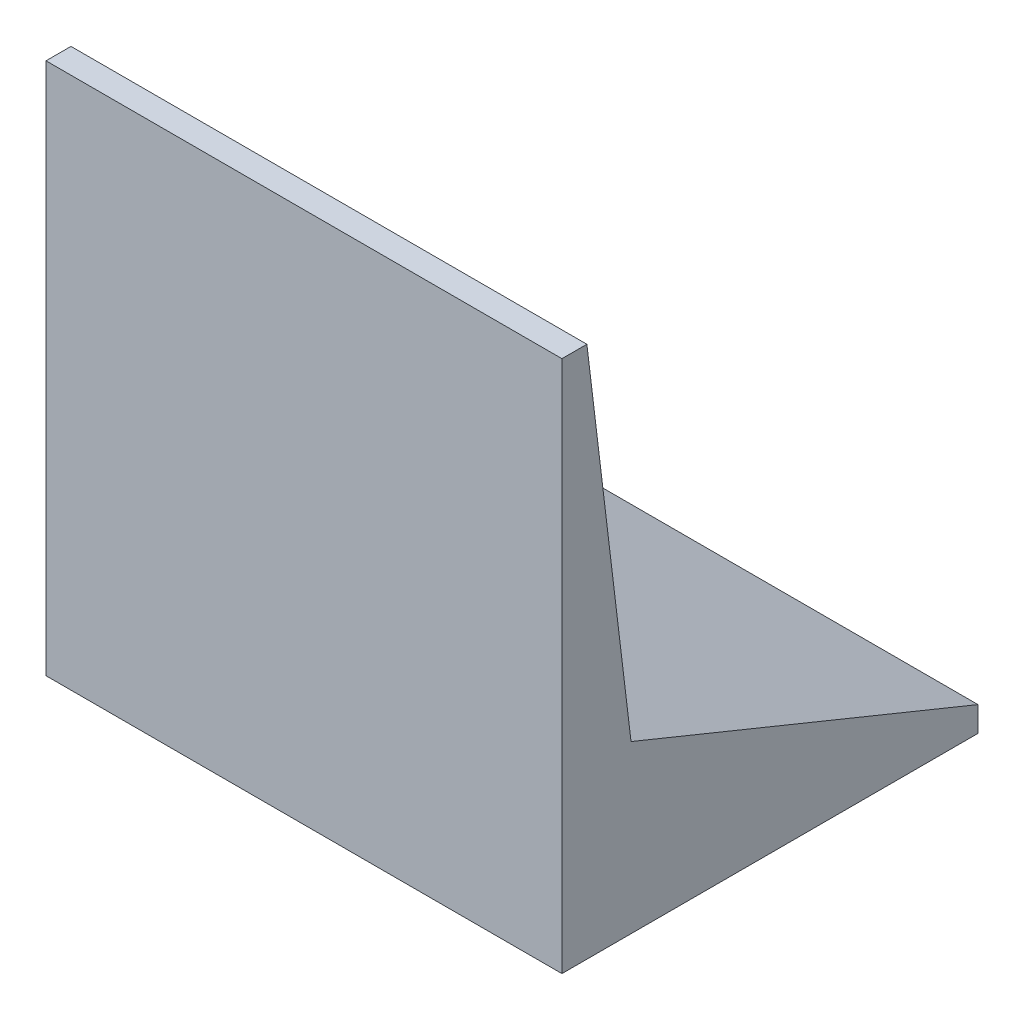
ISO-10303-21;
HEADER;
FILE_DESCRIPTION(('STEP AP214'),'2;1');
FILE_NAME('part.step','',(''),(''),'','','');
FILE_SCHEMA(('AUTOMOTIVE_DESIGN { 1 0 10303 214 1 1 1 1 }'));
ENDSEC;
DATA;
#1=APPLICATION_CONTEXT('core data for automotive mechanical design processes');
#2=APPLICATION_PROTOCOL_DEFINITION('international standard','automotive_design',2000,#1);
#3=PRODUCT_CONTEXT('',#1,'mechanical');
#4=PRODUCT('Part','Part','',(#3));
#5=PRODUCT_RELATED_PRODUCT_CATEGORY('part','',(#4));
#6=PRODUCT_DEFINITION_FORMATION('','',#4);
#7=PRODUCT_DEFINITION_CONTEXT('part definition',#1,'design');
#8=PRODUCT_DEFINITION('design','',#6,#7);
#9=PRODUCT_DEFINITION_SHAPE('','',#8);
#10=(LENGTH_UNIT() NAMED_UNIT(*) SI_UNIT(.MILLI.,.METRE.));
#11=(NAMED_UNIT(*) PLANE_ANGLE_UNIT() SI_UNIT($,.RADIAN.));
#12=(NAMED_UNIT(*) SI_UNIT($,.STERADIAN.) SOLID_ANGLE_UNIT());
#13=UNCERTAINTY_MEASURE_WITH_UNIT(LENGTH_MEASURE(1.E-05),#10,'distance_accuracy_value','');
#14=(GEOMETRIC_REPRESENTATION_CONTEXT(3) GLOBAL_UNCERTAINTY_ASSIGNED_CONTEXT((#13)) GLOBAL_UNIT_ASSIGNED_CONTEXT((#10,
#11,#12)) REPRESENTATION_CONTEXT('',''));
#15=CARTESIAN_POINT('',(0.,0.,0.));
#16=DIRECTION('',(0.,0.,1.));
#17=DIRECTION('',(1.,0.,0.));
#18=AXIS2_PLACEMENT_3D('',#15,#16,#17);
#19=CARTESIAN_POINT('',(310.,15.,0.));
#20=DIRECTION('',(0.,0.,1.));
#21=DIRECTION('',(1.,0.,0.));
#22=AXIS2_PLACEMENT_3D('',#19,#20,#21);
#23=PLANE('',#22);
#24=DIRECTION('',(0.,1.,0.));
#25=VECTOR('',#24,1.);
#26=CARTESIAN_POINT('',(0.,15.,0.));
#27=LINE('',#26,#25);
#28=CARTESIAN_POINT('',(0.,0.,0.));
#29=VERTEX_POINT('',#28);
#30=CARTESIAN_POINT('',(0.,15.,0.));
#31=VERTEX_POINT('',#30);
#32=EDGE_CURVE('E117',#29,#31,#27,.T.);
#33=ORIENTED_EDGE('',*,*,#32,.T.);
#34=DIRECTION('',(-1.,0.,0.));
#35=VECTOR('',#34,1.);
#36=CARTESIAN_POINT('',(310.,15.,0.));
#37=LINE('',#36,#35);
#38=CARTESIAN_POINT('',(310.,15.,0.));
#39=VERTEX_POINT('',#38);
#40=EDGE_CURVE('E11',#39,#31,#37,.T.);
#41=ORIENTED_EDGE('',*,*,#40,.F.);
#42=DIRECTION('',(0.,1.,0.));
#43=VECTOR('',#42,1.);
#44=CARTESIAN_POINT('',(310.,15.,0.));
#45=LINE('',#44,#43);
#46=CARTESIAN_POINT('',(310.,0.,0.));
#47=VERTEX_POINT('',#46);
#48=EDGE_CURVE('E127',#47,#39,#45,.T.);
#49=ORIENTED_EDGE('',*,*,#48,.F.);
#50=DIRECTION('',(-1.,0.,0.));
#51=VECTOR('',#50,1.);
#52=CARTESIAN_POINT('',(310.,0.,0.));
#53=LINE('',#52,#51);
#54=EDGE_CURVE('E113',#47,#29,#53,.T.);
#55=ORIENTED_EDGE('',*,*,#54,.T.);
#56=EDGE_LOOP('',(#33,#41,#49,#55));
#57=FACE_BOUND('',#56,.T.);
#58=ADVANCED_FACE('F33',(#57),#23,.F.);
#59=CARTESIAN_POINT('',(310.,99.9999999999999,208.478747203579));
#60=DIRECTION('',(0.,-0.925992669111965,0.377541490105259));
#61=DIRECTION('',(0.,-0.377541490105259,-0.925992669111965));
#62=AXIS2_PLACEMENT_3D('',#59,#60,#61);
#63=PLANE('',#62);
#64=DIRECTION('',(0.,0.377541490105259,0.925992669111965));
#65=VECTOR('',#64,1.);
#66=CARTESIAN_POINT('',(0.,99.9999999999999,208.478747203579));
#67=LINE('',#66,#65);
#68=CARTESIAN_POINT('',(0.,99.9999999999999,208.478747203579));
#69=VERTEX_POINT('',#68);
#70=EDGE_CURVE('E120',#31,#69,#67,.T.);
#71=ORIENTED_EDGE('',*,*,#70,.T.);
#72=DIRECTION('',(-1.,0.,0.));
#73=VECTOR('',#72,1.);
#74=CARTESIAN_POINT('',(310.,99.9999999999999,208.478747203579));
#75=LINE('',#74,#73);
#76=CARTESIAN_POINT('',(310.,99.9999999999999,208.478747203579));
#77=VERTEX_POINT('',#76);
#78=EDGE_CURVE('E41',#77,#69,#75,.T.);
#79=ORIENTED_EDGE('',*,*,#78,.F.);
#80=DIRECTION('',(0.,0.377541490105259,0.925992669111965));
#81=VECTOR('',#80,1.);
#82=CARTESIAN_POINT('',(310.,99.9999999999999,208.478747203579));
#83=LINE('',#82,#81);
#84=EDGE_CURVE('E86',#39,#77,#83,.T.);
#85=ORIENTED_EDGE('',*,*,#84,.F.);
#86=ORIENTED_EDGE('',*,*,#40,.T.);
#87=EDGE_LOOP('',(#71,#79,#85,#86));
#88=FACE_BOUND('',#87,.T.);
#89=ADVANCED_FACE('F151',(#88),#63,.F.);
#90=CARTESIAN_POINT('',(310.,320.,235.));
#91=DIRECTION('',(0.,-0.119684622784284,0.992811961586374));
#92=DIRECTION('',(0.,-0.992811961586374,-0.119684622784284));
#93=AXIS2_PLACEMENT_3D('',#90,#91,#92);
#94=PLANE('',#93);
#95=DIRECTION('',(0.,0.992811961586374,0.119684622784284));
#96=VECTOR('',#95,1.);
#97=CARTESIAN_POINT('',(0.,320.,235.));
#98=LINE('',#97,#96);
#99=CARTESIAN_POINT('',(0.,320.,235.));
#100=VERTEX_POINT('',#99);
#101=EDGE_CURVE('E122',#69,#100,#98,.T.);
#102=ORIENTED_EDGE('',*,*,#101,.T.);
#103=DIRECTION('',(-1.,0.,0.));
#104=VECTOR('',#103,1.);
#105=CARTESIAN_POINT('',(310.,320.,235.));
#106=LINE('',#105,#104);
#107=CARTESIAN_POINT('',(310.,320.,235.));
#108=VERTEX_POINT('',#107);
#109=EDGE_CURVE('E108',#108,#100,#106,.T.);
#110=ORIENTED_EDGE('',*,*,#109,.F.);
#111=DIRECTION('',(0.,0.992811961586374,0.119684622784284));
#112=VECTOR('',#111,1.);
#113=CARTESIAN_POINT('',(310.,320.,235.));
#114=LINE('',#113,#112);
#115=EDGE_CURVE('E99',#77,#108,#114,.T.);
#116=ORIENTED_EDGE('',*,*,#115,.F.);
#117=ORIENTED_EDGE('',*,*,#78,.T.);
#118=EDGE_LOOP('',(#102,#110,#116,#117));
#119=FACE_BOUND('',#118,.T.);
#120=ADVANCED_FACE('F133',(#119),#94,.F.);
#121=CARTESIAN_POINT('',(310.,320.,250.));
#122=DIRECTION('',(0.,-1.,0.));
#123=DIRECTION('',(0.,0.,-1.));
#124=AXIS2_PLACEMENT_3D('',#121,#122,#123);
#125=PLANE('',#124);
#126=DIRECTION('',(0.,0.,1.));
#127=VECTOR('',#126,1.);
#128=CARTESIAN_POINT('',(0.,320.,250.));
#129=LINE('',#128,#127);
#130=CARTESIAN_POINT('',(0.,320.,250.));
#131=VERTEX_POINT('',#130);
#132=EDGE_CURVE('E107',#100,#131,#129,.T.);
#133=ORIENTED_EDGE('',*,*,#132,.T.);
#134=DIRECTION('',(-1.,0.,0.));
#135=VECTOR('',#134,1.);
#136=CARTESIAN_POINT('',(310.,320.,250.));
#137=LINE('',#136,#135);
#138=CARTESIAN_POINT('',(310.,320.,250.));
#139=VERTEX_POINT('',#138);
#140=EDGE_CURVE('E104',#139,#131,#137,.T.);
#141=ORIENTED_EDGE('',*,*,#140,.F.);
#142=DIRECTION('',(0.,0.,1.));
#143=VECTOR('',#142,1.);
#144=CARTESIAN_POINT('',(310.,320.,250.));
#145=LINE('',#144,#143);
#146=EDGE_CURVE('E93',#108,#139,#145,.T.);
#147=ORIENTED_EDGE('',*,*,#146,.F.);
#148=ORIENTED_EDGE('',*,*,#109,.T.);
#149=EDGE_LOOP('',(#133,#141,#147,#148));
#150=FACE_BOUND('',#149,.T.);
#151=ADVANCED_FACE('F105',(#150),#125,.F.);
#152=CARTESIAN_POINT('',(310.,0.,250.));
#153=DIRECTION('',(0.,0.,-1.));
#154=DIRECTION('',(-1.,0.,0.));
#155=AXIS2_PLACEMENT_3D('',#152,#153,#154);
#156=PLANE('',#155);
#157=DIRECTION('',(0.,-1.,0.));
#158=VECTOR('',#157,1.);
#159=CARTESIAN_POINT('',(0.,0.,250.));
#160=LINE('',#159,#158);
#161=CARTESIAN_POINT('',(0.,0.,250.));
#162=VERTEX_POINT('',#161);
#163=EDGE_CURVE('E72',#131,#162,#160,.T.);
#164=ORIENTED_EDGE('',*,*,#163,.T.);
#165=DIRECTION('',(-1.,0.,0.));
#166=VECTOR('',#165,1.);
#167=CARTESIAN_POINT('',(310.,0.,250.));
#168=LINE('',#167,#166);
#169=CARTESIAN_POINT('',(310.,0.,250.));
#170=VERTEX_POINT('',#169);
#171=EDGE_CURVE('E109',#170,#162,#168,.T.);
#172=ORIENTED_EDGE('',*,*,#171,.F.);
#173=DIRECTION('',(0.,-1.,0.));
#174=VECTOR('',#173,1.);
#175=CARTESIAN_POINT('',(310.,0.,250.));
#176=LINE('',#175,#174);
#177=EDGE_CURVE('E97',#139,#170,#176,.T.);
#178=ORIENTED_EDGE('',*,*,#177,.F.);
#179=ORIENTED_EDGE('',*,*,#140,.T.);
#180=EDGE_LOOP('',(#164,#172,#178,#179));
#181=FACE_BOUND('',#180,.T.);
#182=ADVANCED_FACE('F111',(#181),#156,.F.);
#183=CARTESIAN_POINT('',(310.,0.,0.));
#184=DIRECTION('',(0.,1.,0.));
#185=DIRECTION('',(0.,0.,1.));
#186=AXIS2_PLACEMENT_3D('',#183,#184,#185);
#187=PLANE('',#186);
#188=DIRECTION('',(0.,0.,-1.));
#189=VECTOR('',#188,1.);
#190=CARTESIAN_POINT('',(0.,0.,0.));
#191=LINE('',#190,#189);
#192=EDGE_CURVE('E78',#162,#29,#191,.T.);
#193=ORIENTED_EDGE('',*,*,#192,.T.);
#194=ORIENTED_EDGE('',*,*,#54,.F.);
#195=DIRECTION('',(0.,0.,-1.));
#196=VECTOR('',#195,1.);
#197=CARTESIAN_POINT('',(310.,0.,0.));
#198=LINE('',#197,#196);
#199=EDGE_CURVE('E49',#170,#47,#198,.T.);
#200=ORIENTED_EDGE('',*,*,#199,.F.);
#201=ORIENTED_EDGE('',*,*,#171,.T.);
#202=EDGE_LOOP('',(#193,#194,#200,#201));
#203=FACE_BOUND('',#202,.T.);
#204=ADVANCED_FACE('F140',(#203),#187,.F.);
#205=CARTESIAN_POINT('',(310.,0.,0.));
#206=DIRECTION('',(-1.,0.,0.));
#207=DIRECTION('',(0.,0.,1.));
#208=AXIS2_PLACEMENT_3D('',#205,#206,#207);
#209=PLANE('',#208);
#210=ORIENTED_EDGE('',*,*,#48,.T.);
#211=ORIENTED_EDGE('',*,*,#84,.T.);
#212=ORIENTED_EDGE('',*,*,#115,.T.);
#213=ORIENTED_EDGE('',*,*,#146,.T.);
#214=ORIENTED_EDGE('',*,*,#177,.T.);
#215=ORIENTED_EDGE('',*,*,#199,.T.);
#216=EDGE_LOOP('',(#210,#211,#212,#213,#214,#215));
#217=FACE_BOUND('',#216,.T.);
#218=ADVANCED_FACE('F95',(#217),#209,.F.);
#219=CARTESIAN_POINT('',(0.,0.,0.));
#220=DIRECTION('',(-1.,0.,0.));
#221=DIRECTION('',(0.,0.,1.));
#222=AXIS2_PLACEMENT_3D('',#219,#220,#221);
#223=PLANE('',#222);
#224=ORIENTED_EDGE('',*,*,#32,.F.);
#225=ORIENTED_EDGE('',*,*,#192,.F.);
#226=ORIENTED_EDGE('',*,*,#163,.F.);
#227=ORIENTED_EDGE('',*,*,#132,.F.);
#228=ORIENTED_EDGE('',*,*,#101,.F.);
#229=ORIENTED_EDGE('',*,*,#70,.F.);
#230=EDGE_LOOP('',(#224,#225,#226,#227,#228,#229));
#231=FACE_BOUND('',#230,.T.);
#232=ADVANCED_FACE('F136',(#231),#223,.T.);
#233=CLOSED_SHELL('',(#58,#89,#120,#151,#182,#204,#218,#232));
#234=MANIFOLD_SOLID_BREP('B2',#233);
#235=ADVANCED_BREP_SHAPE_REPRESENTATION('',(#18,#234),#14);
#236=SHAPE_DEFINITION_REPRESENTATION(#9,#235);
ENDSEC;
END-ISO-10303-21;
